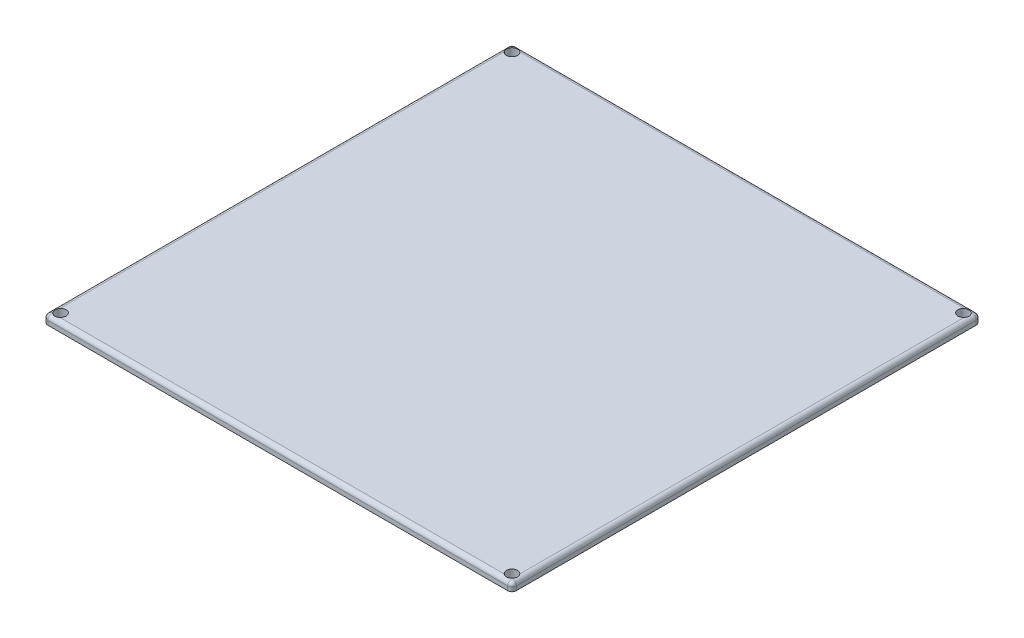
ISO-10303-21;
HEADER;
FILE_DESCRIPTION(('STEP AP214'),'2;1');
FILE_NAME('part.step','',(''),(''),'','','');
FILE_SCHEMA(('AUTOMOTIVE_DESIGN { 1 0 10303 214 1 1 1 1 }'));
ENDSEC;
DATA;
#1=APPLICATION_CONTEXT('core data for automotive mechanical design processes');
#2=APPLICATION_PROTOCOL_DEFINITION('international standard','automotive_design',2000,#1);
#3=PRODUCT_CONTEXT('',#1,'mechanical');
#4=PRODUCT('Part','Part','',(#3));
#5=PRODUCT_RELATED_PRODUCT_CATEGORY('part','',(#4));
#6=PRODUCT_DEFINITION_FORMATION('','',#4);
#7=PRODUCT_DEFINITION_CONTEXT('part definition',#1,'design');
#8=PRODUCT_DEFINITION('design','',#6,#7);
#9=PRODUCT_DEFINITION_SHAPE('','',#8);
#10=(LENGTH_UNIT() NAMED_UNIT(*) SI_UNIT(.MILLI.,.METRE.));
#11=(NAMED_UNIT(*) PLANE_ANGLE_UNIT() SI_UNIT($,.RADIAN.));
#12=(NAMED_UNIT(*) SI_UNIT($,.STERADIAN.) SOLID_ANGLE_UNIT());
#13=UNCERTAINTY_MEASURE_WITH_UNIT(LENGTH_MEASURE(1.E-05),#10,'distance_accuracy_value','');
#14=(GEOMETRIC_REPRESENTATION_CONTEXT(3) GLOBAL_UNCERTAINTY_ASSIGNED_CONTEXT((#13)) GLOBAL_UNIT_ASSIGNED_CONTEXT((#10,
#11,#12)) REPRESENTATION_CONTEXT('',''));
#15=CARTESIAN_POINT('',(0.,0.,0.));
#16=DIRECTION('',(0.,0.,1.));
#17=DIRECTION('',(1.,0.,0.));
#18=AXIS2_PLACEMENT_3D('',#15,#16,#17);
#19=CARTESIAN_POINT('',(0.,2.,0.));
#20=DIRECTION('',(0.,1.,0.));
#21=DIRECTION('',(0.,0.,1.));
#22=AXIS2_PLACEMENT_3D('',#19,#20,#21);
#23=PLANE('',#22);
#24=CARTESIAN_POINT('',(-56.4375,2.,72.765625));
#25=DIRECTION('',(0.,1.,0.));
#26=DIRECTION('',(0.,0.,1.));
#27=AXIS2_PLACEMENT_3D('',#24,#25,#26);
#28=CIRCLE('',#27,1.3);
#29=CARTESIAN_POINT('',(-55.6068376137082,2.,73.765625));
#30=VERTEX_POINT('',#29);
#31=CARTESIAN_POINT('',(-57.4375,2.,71.9349626137082));
#32=VERTEX_POINT('',#31);
#33=EDGE_CURVE('E395',#30,#32,#28,.T.);
#34=ORIENTED_EDGE('',*,*,#33,.F.);
#35=DIRECTION('',(1.,0.,0.));
#36=VECTOR('',#35,1.);
#37=CARTESIAN_POINT('',(50.5625,2.,73.765625));
#38=LINE('',#37,#36);
#39=CARTESIAN_POINT('',(48.7318376137082,2.,73.765625));
#40=VERTEX_POINT('',#39);
#41=EDGE_CURVE('E244',#30,#40,#38,.T.);
#42=ORIENTED_EDGE('',*,*,#41,.T.);
#43=CARTESIAN_POINT('',(49.5625,2.,72.765625));
#44=DIRECTION('',(0.,1.,0.));
#45=DIRECTION('',(0.,0.,1.));
#46=AXIS2_PLACEMENT_3D('',#43,#44,#45);
#47=CIRCLE('',#46,1.3);
#48=CARTESIAN_POINT('',(50.5625,2.,71.9349626137082));
#49=VERTEX_POINT('',#48);
#50=EDGE_CURVE('E387',#49,#40,#47,.T.);
#51=ORIENTED_EDGE('',*,*,#50,.F.);
#52=DIRECTION('',(0.,0.,-1.));
#53=VECTOR('',#52,1.);
#54=CARTESIAN_POINT('',(50.5625,2.,-34.234375));
#55=LINE('',#54,#53);
#56=CARTESIAN_POINT('',(50.5625,2.,-32.4037126137082));
#57=VERTEX_POINT('',#56);
#58=EDGE_CURVE('E225',#49,#57,#55,.T.);
#59=ORIENTED_EDGE('',*,*,#58,.T.);
#60=CARTESIAN_POINT('',(49.5625,2.,-33.234375));
#61=DIRECTION('',(0.,1.,0.));
#62=DIRECTION('',(0.,0.,1.));
#63=AXIS2_PLACEMENT_3D('',#60,#61,#62);
#64=CIRCLE('',#63,1.3);
#65=CARTESIAN_POINT('',(48.7318376137082,2.,-34.234375));
#66=VERTEX_POINT('',#65);
#67=EDGE_CURVE('E403',#66,#57,#64,.T.);
#68=ORIENTED_EDGE('',*,*,#67,.F.);
#69=DIRECTION('',(-1.,0.,0.));
#70=VECTOR('',#69,1.);
#71=CARTESIAN_POINT('',(-57.4375,2.,-34.234375));
#72=LINE('',#71,#70);
#73=CARTESIAN_POINT('',(-55.6068376137082,2.,-34.234375));
#74=VERTEX_POINT('',#73);
#75=EDGE_CURVE('E235',#66,#74,#72,.T.);
#76=ORIENTED_EDGE('',*,*,#75,.T.);
#77=CARTESIAN_POINT('',(-56.4375,2.,-33.234375));
#78=DIRECTION('',(0.,1.,0.));
#79=DIRECTION('',(0.,0.,1.));
#80=AXIS2_PLACEMENT_3D('',#77,#78,#79);
#81=CIRCLE('',#80,1.3);
#82=CARTESIAN_POINT('',(-57.4375,2.,-32.4037126137082));
#83=VERTEX_POINT('',#82);
#84=EDGE_CURVE('E409',#83,#74,#81,.T.);
#85=ORIENTED_EDGE('',*,*,#84,.F.);
#86=DIRECTION('',(0.,0.,1.));
#87=VECTOR('',#86,1.);
#88=CARTESIAN_POINT('',(-57.4375,2.,73.765625));
#89=LINE('',#88,#87);
#90=EDGE_CURVE('E242',#83,#32,#89,.T.);
#91=ORIENTED_EDGE('',*,*,#90,.T.);
#92=EDGE_LOOP('',(#34,#42,#51,#59,#68,#76,#85,#91));
#93=FACE_BOUND('',#92,.T.);
#94=ADVANCED_FACE('F35',(#93),#23,.T.);
#95=DIRECTION('',(0.,0.,1.));
#96=VECTOR('',#95,1.);
#97=CARTESIAN_POINT('',(-57.4375,2.,73.765625));
#98=LINE('',#97,#96);
#99=CARTESIAN_POINT('',(-57.4375,2.,73.5962873862918));
#100=VERTEX_POINT('',#99);
#101=CARTESIAN_POINT('',(-57.4375,2.,73.765625));
#102=VERTEX_POINT('',#101);
#103=EDGE_CURVE('E237',#100,#102,#98,.T.);
#104=ORIENTED_EDGE('',*,*,#103,.T.);
#105=DIRECTION('',(1.,0.,0.));
#106=VECTOR('',#105,1.);
#107=CARTESIAN_POINT('',(50.5625,2.,73.765625));
#108=LINE('',#107,#106);
#109=CARTESIAN_POINT('',(-57.2681623862918,2.,73.765625));
#110=VERTEX_POINT('',#109);
#111=EDGE_CURVE('E239',#102,#110,#108,.T.);
#112=ORIENTED_EDGE('',*,*,#111,.T.);
#113=EDGE_CURVE('E399',#100,#110,#28,.T.);
#114=ORIENTED_EDGE('',*,*,#113,.F.);
#115=EDGE_LOOP('',(#104,#112,#114));
#116=FACE_BOUND('',#115,.T.);
#117=ADVANCED_FACE('F464',(#116),#23,.T.);
#118=DIRECTION('',(-1.,0.,0.));
#119=VECTOR('',#118,1.);
#120=CARTESIAN_POINT('',(-57.4375,2.,-34.234375));
#121=LINE('',#120,#119);
#122=CARTESIAN_POINT('',(-57.2681623862918,2.,-34.234375));
#123=VERTEX_POINT('',#122);
#124=CARTESIAN_POINT('',(-57.4375,2.,-34.234375));
#125=VERTEX_POINT('',#124);
#126=EDGE_CURVE('E231',#123,#125,#121,.T.);
#127=ORIENTED_EDGE('',*,*,#126,.T.);
#128=DIRECTION('',(0.,0.,1.));
#129=VECTOR('',#128,1.);
#130=CARTESIAN_POINT('',(-57.4375,2.,73.765625));
#131=LINE('',#130,#129);
#132=CARTESIAN_POINT('',(-57.4375,2.,-34.0650373862918));
#133=VERTEX_POINT('',#132);
#134=EDGE_CURVE('E233',#125,#133,#131,.T.);
#135=ORIENTED_EDGE('',*,*,#134,.T.);
#136=EDGE_CURVE('E194',#123,#133,#81,.T.);
#137=ORIENTED_EDGE('',*,*,#136,.F.);
#138=EDGE_LOOP('',(#127,#135,#137));
#139=FACE_BOUND('',#138,.T.);
#140=ADVANCED_FACE('F468',(#139),#23,.T.);
#141=CARTESIAN_POINT('',(50.3931623862918,2.,73.765625));
#142=VERTEX_POINT('',#141);
#143=CARTESIAN_POINT('',(50.5625,2.,73.5962873862918));
#144=VERTEX_POINT('',#143);
#145=EDGE_CURVE('E392',#142,#144,#47,.T.);
#146=ORIENTED_EDGE('',*,*,#145,.F.);
#147=DIRECTION('',(1.,0.,0.));
#148=VECTOR('',#147,1.);
#149=CARTESIAN_POINT('',(50.5625,2.,73.765625));
#150=LINE('',#149,#148);
#151=CARTESIAN_POINT('',(50.5625,2.,73.765625));
#152=VERTEX_POINT('',#151);
#153=EDGE_CURVE('E229',#142,#152,#150,.T.);
#154=ORIENTED_EDGE('',*,*,#153,.T.);
#155=DIRECTION('',(0.,0.,-1.));
#156=VECTOR('',#155,1.);
#157=CARTESIAN_POINT('',(50.5625,2.,-34.234375));
#158=LINE('',#157,#156);
#159=EDGE_CURVE('E227',#152,#144,#158,.T.);
#160=ORIENTED_EDGE('',*,*,#159,.T.);
#161=EDGE_LOOP('',(#146,#154,#160));
#162=FACE_BOUND('',#161,.T.);
#163=ADVANCED_FACE('F298',(#162),#23,.T.);
#164=DIRECTION('',(0.,0.,-1.));
#165=VECTOR('',#164,1.);
#166=CARTESIAN_POINT('',(50.5625,2.,-34.234375));
#167=LINE('',#166,#165);
#168=CARTESIAN_POINT('',(50.5625,2.,-34.0650373862918));
#169=VERTEX_POINT('',#168);
#170=CARTESIAN_POINT('',(50.5625,2.,-34.234375));
#171=VERTEX_POINT('',#170);
#172=EDGE_CURVE('E221',#169,#171,#167,.T.);
#173=ORIENTED_EDGE('',*,*,#172,.T.);
#174=DIRECTION('',(-1.,0.,0.));
#175=VECTOR('',#174,1.);
#176=CARTESIAN_POINT('',(-57.4375,2.,-34.234375));
#177=LINE('',#176,#175);
#178=CARTESIAN_POINT('',(50.3931623862918,2.,-34.234375));
#179=VERTEX_POINT('',#178);
#180=EDGE_CURVE('E223',#171,#179,#177,.T.);
#181=ORIENTED_EDGE('',*,*,#180,.T.);
#182=EDGE_CURVE('E406',#169,#179,#64,.T.);
#183=ORIENTED_EDGE('',*,*,#182,.F.);
#184=EDGE_LOOP('',(#173,#181,#183));
#185=FACE_BOUND('',#184,.T.);
#186=ADVANCED_FACE('F294',(#185),#23,.T.);
#187=CARTESIAN_POINT('',(0.,0.,0.));
#188=DIRECTION('',(0.,1.,0.));
#189=DIRECTION('',(0.,0.,1.));
#190=AXIS2_PLACEMENT_3D('',#187,#188,#189);
#191=PLANE('',#190);
#192=CARTESIAN_POINT('',(-56.4375,0.,72.765625));
#193=DIRECTION('',(0.,1.,0.));
#194=DIRECTION('',(0.,0.,1.));
#195=AXIS2_PLACEMENT_3D('',#192,#193,#194);
#196=CIRCLE('',#195,1.3);
#197=CARTESIAN_POINT('',(-56.4375,0.,74.065625));
#198=VERTEX_POINT('',#197);
#199=EDGE_CURVE('E400',#198,#198,#196,.T.);
#200=ORIENTED_EDGE('',*,*,#199,.T.);
#201=EDGE_LOOP('',(#200));
#202=FACE_BOUND('',#201,.T.);
#203=CARTESIAN_POINT('',(-56.4375,0.,-33.234375));
#204=DIRECTION('',(0.,1.,0.));
#205=DIRECTION('',(0.,0.,1.));
#206=AXIS2_PLACEMENT_3D('',#203,#204,#205);
#207=CIRCLE('',#206,1.3);
#208=CARTESIAN_POINT('',(-56.4375,0.,-31.934375));
#209=VERTEX_POINT('',#208);
#210=EDGE_CURVE('E411',#209,#209,#207,.T.);
#211=ORIENTED_EDGE('',*,*,#210,.T.);
#212=EDGE_LOOP('',(#211));
#213=FACE_BOUND('',#212,.T.);
#214=DIRECTION('',(0.,0.,1.));
#215=VECTOR('',#214,1.);
#216=CARTESIAN_POINT('',(-58.4375,0.,-35.234375));
#217=LINE('',#216,#215);
#218=CARTESIAN_POINT('',(-58.4375,0.,-34.234375));
#219=VERTEX_POINT('',#218);
#220=CARTESIAN_POINT('',(-58.4375,0.,73.765625));
#221=VERTEX_POINT('',#220);
#222=EDGE_CURVE('E190',#219,#221,#217,.T.);
#223=ORIENTED_EDGE('',*,*,#222,.F.);
#224=CARTESIAN_POINT('',(-57.4375,0.,-34.234375));
#225=DIRECTION('',(0.,1.,0.));
#226=DIRECTION('',(0.,0.,1.));
#227=AXIS2_PLACEMENT_3D('',#224,#225,#226);
#228=CIRCLE('',#227,1.);
#229=CARTESIAN_POINT('',(-57.4375,0.,-35.234375));
#230=VERTEX_POINT('',#229);
#231=EDGE_CURVE('E206',#219,#230,#228,.F.);
#232=ORIENTED_EDGE('',*,*,#231,.T.);
#233=DIRECTION('',(-1.,0.,0.));
#234=VECTOR('',#233,1.);
#235=CARTESIAN_POINT('',(-58.4375,0.,-35.234375));
#236=LINE('',#235,#234);
#237=CARTESIAN_POINT('',(50.5625,0.,-35.234375));
#238=VERTEX_POINT('',#237);
#239=EDGE_CURVE('E174',#238,#230,#236,.T.);
#240=ORIENTED_EDGE('',*,*,#239,.F.);
#241=CARTESIAN_POINT('',(50.5625,0.,-34.234375));
#242=DIRECTION('',(0.,1.,0.));
#243=DIRECTION('',(0.,0.,1.));
#244=AXIS2_PLACEMENT_3D('',#241,#242,#243);
#245=CIRCLE('',#244,1.);
#246=CARTESIAN_POINT('',(51.5625,0.,-34.234375));
#247=VERTEX_POINT('',#246);
#248=EDGE_CURVE('E204',#238,#247,#245,.F.);
#249=ORIENTED_EDGE('',*,*,#248,.T.);
#250=DIRECTION('',(0.,0.,-1.));
#251=VECTOR('',#250,1.);
#252=CARTESIAN_POINT('',(51.5625,0.,-35.234375));
#253=LINE('',#252,#251);
#254=CARTESIAN_POINT('',(51.5625,0.,73.765625));
#255=VERTEX_POINT('',#254);
#256=EDGE_CURVE('E189',#255,#247,#253,.T.);
#257=ORIENTED_EDGE('',*,*,#256,.F.);
#258=CARTESIAN_POINT('',(50.5625,0.,73.765625));
#259=DIRECTION('',(0.,1.,0.));
#260=DIRECTION('',(0.,0.,1.));
#261=AXIS2_PLACEMENT_3D('',#258,#259,#260);
#262=CIRCLE('',#261,1.);
#263=CARTESIAN_POINT('',(50.5625,0.,74.765625));
#264=VERTEX_POINT('',#263);
#265=EDGE_CURVE('E188',#255,#264,#262,.F.);
#266=ORIENTED_EDGE('',*,*,#265,.T.);
#267=DIRECTION('',(1.,0.,0.));
#268=VECTOR('',#267,1.);
#269=CARTESIAN_POINT('',(-58.4375,0.,74.765625));
#270=LINE('',#269,#268);
#271=CARTESIAN_POINT('',(-57.4375,0.,74.765625));
#272=VERTEX_POINT('',#271);
#273=EDGE_CURVE('E167',#272,#264,#270,.T.);
#274=ORIENTED_EDGE('',*,*,#273,.F.);
#275=CARTESIAN_POINT('',(-57.4375,0.,73.765625));
#276=DIRECTION('',(0.,1.,0.));
#277=DIRECTION('',(0.,0.,1.));
#278=AXIS2_PLACEMENT_3D('',#275,#276,#277);
#279=CIRCLE('',#278,1.);
#280=EDGE_CURVE('E173',#272,#221,#279,.F.);
#281=ORIENTED_EDGE('',*,*,#280,.T.);
#282=EDGE_LOOP('',(#223,#232,#240,#249,#257,#266,#274,#281));
#283=FACE_BOUND('',#282,.T.);
#284=CARTESIAN_POINT('',(49.5625,0.,-33.234375));
#285=DIRECTION('',(0.,1.,0.));
#286=DIRECTION('',(0.,0.,1.));
#287=AXIS2_PLACEMENT_3D('',#284,#285,#286);
#288=CIRCLE('',#287,1.3);
#289=CARTESIAN_POINT('',(49.5625,0.,-31.934375));
#290=VERTEX_POINT('',#289);
#291=EDGE_CURVE('E398',#290,#290,#288,.T.);
#292=ORIENTED_EDGE('',*,*,#291,.T.);
#293=EDGE_LOOP('',(#292));
#294=FACE_BOUND('',#293,.T.);
#295=CARTESIAN_POINT('',(49.5625,0.,72.765625));
#296=DIRECTION('',(0.,1.,0.));
#297=DIRECTION('',(0.,0.,1.));
#298=AXIS2_PLACEMENT_3D('',#295,#296,#297);
#299=CIRCLE('',#298,1.3);
#300=CARTESIAN_POINT('',(49.5625,0.,74.065625));
#301=VERTEX_POINT('',#300);
#302=EDGE_CURVE('E383',#301,#301,#299,.T.);
#303=ORIENTED_EDGE('',*,*,#302,.T.);
#304=EDGE_LOOP('',(#303));
#305=FACE_BOUND('',#304,.T.);
#306=ADVANCED_FACE('F184',(#202,#213,#283,#294,#305),#191,.F.);
#307=CARTESIAN_POINT('',(-58.4375,2.,-35.234375));
#308=DIRECTION('',(1.,0.,0.));
#309=DIRECTION('',(0.,0.,-1.));
#310=AXIS2_PLACEMENT_3D('',#307,#308,#309);
#311=PLANE('',#310);
#312=DIRECTION('',(0.,-1.,0.));
#313=VECTOR('',#312,1.);
#314=CARTESIAN_POINT('',(-58.4375,2.,73.765625));
#315=LINE('',#314,#313);
#316=CARTESIAN_POINT('',(-58.4375,1.,73.765625));
#317=VERTEX_POINT('',#316);
#318=EDGE_CURVE('E180',#221,#317,#315,.F.);
#319=ORIENTED_EDGE('',*,*,#318,.T.);
#320=DIRECTION('',(0.,0.,1.));
#321=VECTOR('',#320,1.);
#322=CARTESIAN_POINT('',(-58.4375,1.,-34.234375));
#323=LINE('',#322,#321);
#324=CARTESIAN_POINT('',(-58.4375,1.,-34.234375));
#325=VERTEX_POINT('',#324);
#326=EDGE_CURVE('E279',#317,#325,#323,.F.);
#327=ORIENTED_EDGE('',*,*,#326,.T.);
#328=DIRECTION('',(0.,-1.,0.));
#329=VECTOR('',#328,1.);
#330=CARTESIAN_POINT('',(-58.4375,2.,-34.234375));
#331=LINE('',#330,#329);
#332=EDGE_CURVE('E201',#325,#219,#331,.T.);
#333=ORIENTED_EDGE('',*,*,#332,.T.);
#334=ORIENTED_EDGE('',*,*,#222,.T.);
#335=EDGE_LOOP('',(#319,#327,#333,#334));
#336=FACE_BOUND('',#335,.T.);
#337=ADVANCED_FACE('F302',(#336),#311,.F.);
#338=CARTESIAN_POINT('',(-58.4375,2.,74.765625));
#339=DIRECTION('',(0.,0.,-1.));
#340=DIRECTION('',(-1.,0.,0.));
#341=AXIS2_PLACEMENT_3D('',#338,#339,#340);
#342=PLANE('',#341);
#343=DIRECTION('',(0.,-1.,0.));
#344=VECTOR('',#343,1.);
#345=CARTESIAN_POINT('',(50.5625,2.,74.765625));
#346=LINE('',#345,#344);
#347=CARTESIAN_POINT('',(50.5625,1.,74.765625));
#348=VERTEX_POINT('',#347);
#349=EDGE_CURVE('E216',#264,#348,#346,.F.);
#350=ORIENTED_EDGE('',*,*,#349,.T.);
#351=DIRECTION('',(1.,0.,0.));
#352=VECTOR('',#351,1.);
#353=CARTESIAN_POINT('',(-57.4375,1.,74.765625));
#354=LINE('',#353,#352);
#355=CARTESIAN_POINT('',(-57.4375,1.,74.765625));
#356=VERTEX_POINT('',#355);
#357=EDGE_CURVE('E170',#348,#356,#354,.F.);
#358=ORIENTED_EDGE('',*,*,#357,.T.);
#359=DIRECTION('',(0.,-1.,0.));
#360=VECTOR('',#359,1.);
#361=CARTESIAN_POINT('',(-57.4375,2.,74.765625));
#362=LINE('',#361,#360);
#363=EDGE_CURVE('E162',#356,#272,#362,.T.);
#364=ORIENTED_EDGE('',*,*,#363,.T.);
#365=ORIENTED_EDGE('',*,*,#273,.T.);
#366=EDGE_LOOP('',(#350,#358,#364,#365));
#367=FACE_BOUND('',#366,.T.);
#368=ADVANCED_FACE('F165',(#367),#342,.F.);
#369=CARTESIAN_POINT('',(51.5625,2.,-35.234375));
#370=DIRECTION('',(-1.,0.,0.));
#371=DIRECTION('',(0.,0.,1.));
#372=AXIS2_PLACEMENT_3D('',#369,#370,#371);
#373=PLANE('',#372);
#374=DIRECTION('',(0.,-1.,0.));
#375=VECTOR('',#374,1.);
#376=CARTESIAN_POINT('',(51.5625,2.,-34.234375));
#377=LINE('',#376,#375);
#378=CARTESIAN_POINT('',(51.5625,1.,-34.234375));
#379=VERTEX_POINT('',#378);
#380=EDGE_CURVE('E214',#247,#379,#377,.F.);
#381=ORIENTED_EDGE('',*,*,#380,.T.);
#382=DIRECTION('',(0.,0.,-1.));
#383=VECTOR('',#382,1.);
#384=CARTESIAN_POINT('',(51.5625,1.,73.765625));
#385=LINE('',#384,#383);
#386=CARTESIAN_POINT('',(51.5625,1.,73.765625));
#387=VERTEX_POINT('',#386);
#388=EDGE_CURVE('E11',#379,#387,#385,.F.);
#389=ORIENTED_EDGE('',*,*,#388,.T.);
#390=DIRECTION('',(0.,-1.,0.));
#391=VECTOR('',#390,1.);
#392=CARTESIAN_POINT('',(51.5625,2.,73.765625));
#393=LINE('',#392,#391);
#394=EDGE_CURVE('E212',#387,#255,#393,.T.);
#395=ORIENTED_EDGE('',*,*,#394,.T.);
#396=ORIENTED_EDGE('',*,*,#256,.T.);
#397=EDGE_LOOP('',(#381,#389,#395,#396));
#398=FACE_BOUND('',#397,.T.);
#399=ADVANCED_FACE('F306',(#398),#373,.F.);
#400=CARTESIAN_POINT('',(-58.4375,2.,-35.234375));
#401=DIRECTION('',(0.,0.,1.));
#402=DIRECTION('',(1.,0.,0.));
#403=AXIS2_PLACEMENT_3D('',#400,#401,#402);
#404=PLANE('',#403);
#405=DIRECTION('',(0.,-1.,0.));
#406=VECTOR('',#405,1.);
#407=CARTESIAN_POINT('',(-57.4375,2.,-35.234375));
#408=LINE('',#407,#406);
#409=CARTESIAN_POINT('',(-57.4375,1.,-35.234375));
#410=VERTEX_POINT('',#409);
#411=EDGE_CURVE('E210',#230,#410,#408,.F.);
#412=ORIENTED_EDGE('',*,*,#411,.T.);
#413=DIRECTION('',(-1.,0.,0.));
#414=VECTOR('',#413,1.);
#415=CARTESIAN_POINT('',(50.5625,1.,-35.234375));
#416=LINE('',#415,#414);
#417=CARTESIAN_POINT('',(50.5625,1.,-35.234375));
#418=VERTEX_POINT('',#417);
#419=EDGE_CURVE('E59',#410,#418,#416,.F.);
#420=ORIENTED_EDGE('',*,*,#419,.T.);
#421=DIRECTION('',(0.,-1.,0.));
#422=VECTOR('',#421,1.);
#423=CARTESIAN_POINT('',(50.5625,2.,-35.234375));
#424=LINE('',#423,#422);
#425=EDGE_CURVE('E208',#418,#238,#424,.T.);
#426=ORIENTED_EDGE('',*,*,#425,.T.);
#427=ORIENTED_EDGE('',*,*,#239,.T.);
#428=EDGE_LOOP('',(#412,#420,#426,#427));
#429=FACE_BOUND('',#428,.T.);
#430=ADVANCED_FACE('F291',(#429),#404,.F.);
#431=CARTESIAN_POINT('',(-56.4375,2.,-33.234375));
#432=DIRECTION('',(0.,-1.,0.));
#433=DIRECTION('',(0.,0.,-1.));
#434=AXIS2_PLACEMENT_3D('',#431,#432,#433);
#435=CYLINDRICAL_SURFACE('',#434,1.3);
#436=ORIENTED_EDGE('',*,*,#136,.T.);
#437=CARTESIAN_POINT('',(-57.4375,2.,-34.0650373862918));
#438=CARTESIAN_POINT('',(-57.4604251223826,1.9999961760534,-34.0374403102604));
#439=CARTESIAN_POINT('',(-57.4821849188267,1.99921243552188,-34.0089179762548));
#440=CARTESIAN_POINT('',(-57.5232425434941,1.99653020231395,-33.9502275512251));
#441=CARTESIAN_POINT('',(-57.542541966135,1.99463243608514,-33.9200605442977));
#442=CARTESIAN_POINT('',(-57.5965939883878,1.9879330826761,-33.8273460760095));
#443=CARTESIAN_POINT('',(-57.6275023668593,1.98212536278494,-33.7625827221245));
#444=CARTESIAN_POINT('',(-57.6782433442636,1.97093841622193,-33.628921460695));
#445=CARTESIAN_POINT('',(-57.6980859557925,1.96555880597682,-33.5600273534935));
#446=CARTESIAN_POINT('',(-57.7261836812957,1.95753839714111,-33.4198237602665));
#447=CARTESIAN_POINT('',(-57.734454770284,1.95489382402592,-33.3485177436489));
#448=CARTESIAN_POINT('',(-57.7391534199322,1.95342172722993,-33.2052940537781));
#449=CARTESIAN_POINT('',(-57.7355511623464,1.95460381353484,-33.1333752936725));
#450=CARTESIAN_POINT('',(-57.7165617946311,1.96032193448002,-32.9911526513206));
#451=CARTESIAN_POINT('',(-57.7011564979927,1.96486314459481,-32.9208514337837));
#452=CARTESIAN_POINT('',(-57.6593134097053,1.97532219691394,-32.7847210660617));
#453=CARTESIAN_POINT('',(-57.6330151627559,1.9812222219503,-32.7188471826613));
#454=CARTESIAN_POINT('',(-57.5700571853419,1.99168643128433,-32.5922848877725));
#455=CARTESIAN_POINT('',(-57.5334266812636,1.99625431067836,-32.5315824697225));
#456=CARTESIAN_POINT('',(-57.4747222154707,1.99945610697892,-32.4501148778391));
#457=CARTESIAN_POINT('',(-57.4565072835425,1.99999461434717,-32.4265838478557));
#458=CARTESIAN_POINT('',(-57.4375,2.,-32.4037126137082));
#459=B_SPLINE_CURVE_WITH_KNOTS('',3,(#437,#438,#439,#440,#441,#442,#443,#444,#445,#446,#447,
#448,#449,#450,#451,#452,#453,#454,#455,#456,#457,#458),.UNSPECIFIED.,.F.,.F.,(4,2,2,2,2,2,2,2,
2,2,4),(0.,0.107536376086472,0.215002706304654,0.429925966078585,0.644654440811261,
0.859086179590809,1.07405684352639,1.28935940909704,1.5019851867795,1.71401544932163,
1.80322525583391),.UNSPECIFIED.);
#460=EDGE_CURVE('E272',#133,#83,#459,.T.);
#461=ORIENTED_EDGE('',*,*,#460,.T.);
#462=ORIENTED_EDGE('',*,*,#84,.T.);
#463=CARTESIAN_POINT('',(-55.6068376137082,2.,-34.234375));
#464=CARTESIAN_POINT('',(-55.6344346897396,1.9999961760534,-34.2573001223826));
#465=CARTESIAN_POINT('',(-55.6629570237451,1.99921243552188,-34.2790599188267));
#466=CARTESIAN_POINT('',(-55.7216474487749,1.99653020231395,-34.3201175434941));
#467=CARTESIAN_POINT('',(-55.7518144557023,1.99463243608514,-34.339416966135));
#468=CARTESIAN_POINT('',(-55.8445289239905,1.98793308267609,-34.3934689883878));
#469=CARTESIAN_POINT('',(-55.9092922778755,1.98212536278494,-34.4243773668593));
#470=CARTESIAN_POINT('',(-56.042953539305,1.97093841622193,-34.4751183442636));
#471=CARTESIAN_POINT('',(-56.1118476465065,1.96555880597682,-34.4949609557925));
#472=CARTESIAN_POINT('',(-56.2520512397335,1.95753839714112,-34.5230586812957));
#473=CARTESIAN_POINT('',(-56.3233572563511,1.95489382402592,-34.531329770284));
#474=CARTESIAN_POINT('',(-56.4665809462219,1.95342172722994,-34.5360284199322));
#475=CARTESIAN_POINT('',(-56.5384997063275,1.95460381353484,-34.5324261623464));
#476=CARTESIAN_POINT('',(-56.6807223486794,1.96032193448002,-34.5134367946311));
#477=CARTESIAN_POINT('',(-56.7510235662163,1.96486314459482,-34.4980314979927));
#478=CARTESIAN_POINT('',(-56.8871539339383,1.97532219691394,-34.4561884097052));
#479=CARTESIAN_POINT('',(-56.9530278173387,1.9812222219503,-34.4298901627559));
#480=CARTESIAN_POINT('',(-57.0795901122275,1.99168643128433,-34.3669321853419));
#481=CARTESIAN_POINT('',(-57.1402925302775,1.99625431067836,-34.3303016812636));
#482=CARTESIAN_POINT('',(-57.2217601221608,1.99945610697892,-34.2715972154707));
#483=CARTESIAN_POINT('',(-57.2452911521443,1.99999461434717,-34.2533822835425));
#484=CARTESIAN_POINT('',(-57.2681623862918,2.,-34.234375));
#485=B_SPLINE_CURVE_WITH_KNOTS('',3,(#463,#464,#465,#466,#467,#468,#469,#470,#471,#472,#473,
#474,#475,#476,#477,#478,#479,#480,#481,#482,#483,#484),.UNSPECIFIED.,.F.,.F.,(4,2,2,2,2,2,2,2,
2,2,4),(0.,0.107536376086467,0.215002706304655,0.429925966078586,0.644654440811246,
0.859086179590808,1.07405684352638,1.28935940909704,1.50198518677949,1.71401544932162,
1.80322525583388),.UNSPECIFIED.);
#486=EDGE_CURVE('E280',#74,#123,#485,.T.);
#487=ORIENTED_EDGE('',*,*,#486,.T.);
#488=EDGE_LOOP('',(#436,#461,#462,#487));
#489=FACE_BOUND('',#488,.T.);
#490=ORIENTED_EDGE('',*,*,#210,.F.);
#491=EDGE_LOOP('',(#490));
#492=FACE_BOUND('',#491,.T.);
#493=ADVANCED_FACE('F286',(#489,#492),#435,.F.);
#494=CARTESIAN_POINT('',(49.5625,2.,-33.234375));
#495=DIRECTION('',(0.,-1.,0.));
#496=DIRECTION('',(0.,0.,-1.));
#497=AXIS2_PLACEMENT_3D('',#494,#495,#496);
#498=CYLINDRICAL_SURFACE('',#497,1.3);
#499=ORIENTED_EDGE('',*,*,#182,.T.);
#500=CARTESIAN_POINT('',(50.3931623862918,2.,-34.234375));
#501=CARTESIAN_POINT('',(50.3655653102604,1.9999961760534,-34.2573001223826));
#502=CARTESIAN_POINT('',(50.3370429762548,1.99921243552188,-34.2790599188267));
#503=CARTESIAN_POINT('',(50.2783525512251,1.99653020231395,-34.3201175434941));
#504=CARTESIAN_POINT('',(50.2481855442977,1.99463243608514,-34.339416966135));
#505=CARTESIAN_POINT('',(50.1554710760095,1.98793308267609,-34.3934689883878));
#506=CARTESIAN_POINT('',(50.0907077221245,1.98212536278494,-34.4243773668593));
#507=CARTESIAN_POINT('',(49.957046460695,1.97093841622193,-34.4751183442636));
#508=CARTESIAN_POINT('',(49.8881523534935,1.96555880597682,-34.4949609557925));
#509=CARTESIAN_POINT('',(49.7479487602665,1.95753839714112,-34.5230586812957));
#510=CARTESIAN_POINT('',(49.6766427436489,1.95489382402592,-34.531329770284));
#511=CARTESIAN_POINT('',(49.5334190537781,1.95342172722994,-34.5360284199322));
#512=CARTESIAN_POINT('',(49.4615002936725,1.95460381353484,-34.5324261623464));
#513=CARTESIAN_POINT('',(49.3192776513206,1.96032193448002,-34.5134367946311));
#514=CARTESIAN_POINT('',(49.2489764337837,1.96486314459482,-34.4980314979927));
#515=CARTESIAN_POINT('',(49.1128460660617,1.97532219691394,-34.4561884097052));
#516=CARTESIAN_POINT('',(49.0469721826613,1.9812222219503,-34.4298901627559));
#517=CARTESIAN_POINT('',(48.9204098877725,1.99168643128433,-34.3669321853419));
#518=CARTESIAN_POINT('',(48.8597074697225,1.99625431067836,-34.3303016812636));
#519=CARTESIAN_POINT('',(48.7782398778392,1.99945610697892,-34.2715972154707));
#520=CARTESIAN_POINT('',(48.7547088478557,1.99999461434717,-34.2533822835425));
#521=CARTESIAN_POINT('',(48.7318376137082,2.,-34.234375));
#522=B_SPLINE_CURVE_WITH_KNOTS('',3,(#500,#501,#502,#503,#504,#505,#506,#507,#508,#509,#510,
#511,#512,#513,#514,#515,#516,#517,#518,#519,#520,#521),.UNSPECIFIED.,.F.,.F.,(4,2,2,2,2,2,2,2,
2,2,4),(0.,0.107536376086467,0.215002706304655,0.429925966078586,0.644654440811246,
0.859086179590808,1.07405684352638,1.28935940909704,1.50198518677949,1.71401544932162,
1.80322525583388),.UNSPECIFIED.);
#523=EDGE_CURVE('E352',#179,#66,#522,.T.);
#524=ORIENTED_EDGE('',*,*,#523,.T.);
#525=ORIENTED_EDGE('',*,*,#67,.T.);
#526=CARTESIAN_POINT('',(50.5625,2.,-32.4037126137082));
#527=CARTESIAN_POINT('',(50.5854251223826,1.9999961760534,-32.4313096897396));
#528=CARTESIAN_POINT('',(50.6071849188267,1.99921243552188,-32.4598320237451));
#529=CARTESIAN_POINT('',(50.6482425434942,1.99653020231395,-32.5185224487748));
#530=CARTESIAN_POINT('',(50.667541966135,1.99463243608514,-32.5486894557023));
#531=CARTESIAN_POINT('',(50.7215939883879,1.98793308267609,-32.6414039239905));
#532=CARTESIAN_POINT('',(50.7525023668593,1.98212536278494,-32.7061672778755));
#533=CARTESIAN_POINT('',(50.8032433442636,1.97093841622193,-32.839828539305));
#534=CARTESIAN_POINT('',(50.8230859557925,1.96555880597682,-32.9087226465065));
#535=CARTESIAN_POINT('',(50.8511836812957,1.95753839714111,-33.0489262397335));
#536=CARTESIAN_POINT('',(50.859454770284,1.95489382402592,-33.1202322563511));
#537=CARTESIAN_POINT('',(50.8641534199322,1.95342172722994,-33.2634559462219));
#538=CARTESIAN_POINT('',(50.8605511623464,1.95460381353484,-33.3353747063275));
#539=CARTESIAN_POINT('',(50.8415617946311,1.96032193448002,-33.4775973486794));
#540=CARTESIAN_POINT('',(50.8261564979927,1.96486314459482,-33.5478985662163));
#541=CARTESIAN_POINT('',(50.7843134097053,1.97532219691394,-33.6840289339383));
#542=CARTESIAN_POINT('',(50.7580151627559,1.9812222219503,-33.7499028173387));
#543=CARTESIAN_POINT('',(50.6950571853419,1.99168643128433,-33.8764651122275));
#544=CARTESIAN_POINT('',(50.6584266812636,1.99625431067836,-33.9371675302775));
#545=CARTESIAN_POINT('',(50.5997222154707,1.99945610697893,-34.0186351221608));
#546=CARTESIAN_POINT('',(50.5815072835425,1.99999461434717,-34.0421661521443));
#547=CARTESIAN_POINT('',(50.5625,2.,-34.0650373862918));
#548=B_SPLINE_CURVE_WITH_KNOTS('',3,(#526,#527,#528,#529,#530,#531,#532,#533,#534,#535,#536,
#537,#538,#539,#540,#541,#542,#543,#544,#545,#546,#547),.UNSPECIFIED.,.F.,.F.,(4,2,2,2,2,2,2,2,
2,2,4),(0.,0.107536376086472,0.215002706304654,0.429925966078585,0.644654440811245,
0.859086179590808,1.07405684352638,1.28935940909704,1.50198518677949,1.71401544932162,
1.80322525583388),.UNSPECIFIED.);
#549=EDGE_CURVE('E347',#57,#169,#548,.T.);
#550=ORIENTED_EDGE('',*,*,#549,.T.);
#551=EDGE_LOOP('',(#499,#524,#525,#550));
#552=FACE_BOUND('',#551,.T.);
#553=ORIENTED_EDGE('',*,*,#291,.F.);
#554=EDGE_LOOP('',(#553));
#555=FACE_BOUND('',#554,.T.);
#556=ADVANCED_FACE('F290',(#552,#555),#498,.F.);
#557=CARTESIAN_POINT('',(-56.4375,2.,72.765625));
#558=DIRECTION('',(0.,-1.,0.));
#559=DIRECTION('',(0.,0.,-1.));
#560=AXIS2_PLACEMENT_3D('',#557,#558,#559);
#561=CYLINDRICAL_SURFACE('',#560,1.3);
#562=ORIENTED_EDGE('',*,*,#113,.T.);
#563=CARTESIAN_POINT('',(-57.2681623862918,2.,73.765625));
#564=CARTESIAN_POINT('',(-57.2405653102604,1.9999961760534,73.7885501223826));
#565=CARTESIAN_POINT('',(-57.2120429762548,1.99921243552188,73.8103099188267));
#566=CARTESIAN_POINT('',(-57.1533525512251,1.99653020231395,73.8513675434941));
#567=CARTESIAN_POINT('',(-57.1231855442977,1.99463243608514,73.870666966135));
#568=CARTESIAN_POINT('',(-57.0304710760095,1.98793308267609,73.9247189883879));
#569=CARTESIAN_POINT('',(-56.9657077221245,1.98212536278494,73.9556273668593));
#570=CARTESIAN_POINT('',(-56.8320464606949,1.97093841622193,74.0063683442636));
#571=CARTESIAN_POINT('',(-56.7631523534935,1.96555880597682,74.0262109557925));
#572=CARTESIAN_POINT('',(-56.6229487602665,1.95753839714111,74.0543086812957));
#573=CARTESIAN_POINT('',(-56.5516427436489,1.95489382402592,74.062579770284));
#574=CARTESIAN_POINT('',(-56.408419053778,1.95342172722994,74.0672784199322));
#575=CARTESIAN_POINT('',(-56.3365002936725,1.95460381353484,74.0636761623464));
#576=CARTESIAN_POINT('',(-56.1942776513206,1.96032193448003,74.0446867946311));
#577=CARTESIAN_POINT('',(-56.1239764337837,1.96486314459482,74.0292814979927));
#578=CARTESIAN_POINT('',(-55.9878460660617,1.97532219691394,73.9874384097052));
#579=CARTESIAN_POINT('',(-55.9219721826613,1.9812222219503,73.9611401627559));
#580=CARTESIAN_POINT('',(-55.7954098877725,1.99168643128433,73.8981821853419));
#581=CARTESIAN_POINT('',(-55.7347074697225,1.99625431067836,73.8615516812636));
#582=CARTESIAN_POINT('',(-55.6532398778391,1.99945610697893,73.8028472154707));
#583=CARTESIAN_POINT('',(-55.6297088478557,1.99999461434717,73.7846322835425));
#584=CARTESIAN_POINT('',(-55.6068376137082,2.,73.765625));
#585=B_SPLINE_CURVE_WITH_KNOTS('',3,(#563,#564,#565,#566,#567,#568,#569,#570,#571,#572,#573,
#574,#575,#576,#577,#578,#579,#580,#581,#582,#583,#584),.UNSPECIFIED.,.F.,.F.,(4,2,2,2,2,2,2,2,
2,2,4),(0.,0.107536376086467,0.215002706304655,0.429925966078598,0.644654440811273,
0.859086179590821,1.0740568435264,1.28935940909706,1.50198518677951,1.71401544932163,
1.80322525583388),.UNSPECIFIED.);
#586=EDGE_CURVE('E252',#110,#30,#585,.T.);
#587=ORIENTED_EDGE('',*,*,#586,.T.);
#588=ORIENTED_EDGE('',*,*,#33,.T.);
#589=CARTESIAN_POINT('',(-57.4375,2.,71.9349626137082));
#590=CARTESIAN_POINT('',(-57.4604251223825,1.9999961760534,71.9625596897396));
#591=CARTESIAN_POINT('',(-57.4821849188267,1.99921243552188,71.9910820237452));
#592=CARTESIAN_POINT('',(-57.5232425434941,1.99653020231395,72.0497724487749));
#593=CARTESIAN_POINT('',(-57.542541966135,1.99463243608514,72.0799394557023));
#594=CARTESIAN_POINT('',(-57.5965939883879,1.98793308267609,72.1726539239905));
#595=CARTESIAN_POINT('',(-57.6275023668593,1.98212536278494,72.2374172778755));
#596=CARTESIAN_POINT('',(-57.6782433442636,1.97093841622193,72.3710785393051));
#597=CARTESIAN_POINT('',(-57.6980859557925,1.96555880597682,72.4399726465065));
#598=CARTESIAN_POINT('',(-57.7261836812957,1.95753839714111,72.5801762397335));
#599=CARTESIAN_POINT('',(-57.734454770284,1.95489382402592,72.6514822563511));
#600=CARTESIAN_POINT('',(-57.7391534199321,1.95342172722994,72.794705946222));
#601=CARTESIAN_POINT('',(-57.7355511623463,1.95460381353484,72.8666247063275));
#602=CARTESIAN_POINT('',(-57.7165617946311,1.96032193448003,73.0088473486794));
#603=CARTESIAN_POINT('',(-57.7011564979927,1.96486314459482,73.0791485662163));
#604=CARTESIAN_POINT('',(-57.6593134097052,1.97532219691394,73.2152789339383));
#605=CARTESIAN_POINT('',(-57.6330151627559,1.9812222219503,73.2811528173387));
#606=CARTESIAN_POINT('',(-57.5700571853419,1.99168643128433,73.4077151122275));
#607=CARTESIAN_POINT('',(-57.5334266812636,1.99625431067836,73.4684175302775));
#608=CARTESIAN_POINT('',(-57.4747222154707,1.99945610697893,73.5498851221609));
#609=CARTESIAN_POINT('',(-57.4565072835425,1.99999461434717,73.5734161521443));
#610=CARTESIAN_POINT('',(-57.4375,2.,73.5962873862918));
#611=B_SPLINE_CURVE_WITH_KNOTS('',3,(#589,#590,#591,#592,#593,#594,#595,#596,#597,#598,#599,
#600,#601,#602,#603,#604,#605,#606,#607,#608,#609,#610),.UNSPECIFIED.,.F.,.F.,(4,2,2,2,2,2,2,2,
2,2,4),(0.,0.107536376086476,0.215002706304668,0.429925966078602,0.644654440811282,
0.859086179590837,1.07405684352641,1.28935940909706,1.5019851867795,1.71401544932164,
1.80322525583387),.UNSPECIFIED.);
#612=EDGE_CURVE('E246',#32,#100,#611,.T.);
#613=ORIENTED_EDGE('',*,*,#612,.T.);
#614=EDGE_LOOP('',(#562,#587,#588,#613));
#615=FACE_BOUND('',#614,.T.);
#616=ORIENTED_EDGE('',*,*,#199,.F.);
#617=EDGE_LOOP('',(#616));
#618=FACE_BOUND('',#617,.T.);
#619=ADVANCED_FACE('F258',(#615,#618),#561,.F.);
#620=CARTESIAN_POINT('',(49.5625,2.,72.765625));
#621=DIRECTION('',(0.,-1.,0.));
#622=DIRECTION('',(0.,0.,-1.));
#623=AXIS2_PLACEMENT_3D('',#620,#621,#622);
#624=CYLINDRICAL_SURFACE('',#623,1.3);
#625=ORIENTED_EDGE('',*,*,#50,.T.);
#626=CARTESIAN_POINT('',(48.7318376137082,2.,73.765625));
#627=CARTESIAN_POINT('',(48.7594346897396,1.9999961760534,73.7885501223826));
#628=CARTESIAN_POINT('',(48.7879570237452,1.99921243552188,73.8103099188267));
#629=CARTESIAN_POINT('',(48.8466474487749,1.99653020231395,73.8513675434941));
#630=CARTESIAN_POINT('',(48.8768144557023,1.99463243608514,73.870666966135));
#631=CARTESIAN_POINT('',(48.9695289239905,1.98793308267609,73.9247189883879));
#632=CARTESIAN_POINT('',(49.0342922778755,1.98212536278494,73.9556273668593));
#633=CARTESIAN_POINT('',(49.1679535393051,1.97093841622193,74.0063683442636));
#634=CARTESIAN_POINT('',(49.2368476465065,1.96555880597682,74.0262109557925));
#635=CARTESIAN_POINT('',(49.3770512397335,1.95753839714111,74.0543086812957));
#636=CARTESIAN_POINT('',(49.4483572563511,1.95489382402592,74.062579770284));
#637=CARTESIAN_POINT('',(49.591580946222,1.95342172722994,74.0672784199322));
#638=CARTESIAN_POINT('',(49.6634997063275,1.95460381353484,74.0636761623464));
#639=CARTESIAN_POINT('',(49.8057223486794,1.96032193448003,74.0446867946311));
#640=CARTESIAN_POINT('',(49.8760235662163,1.96486314459482,74.0292814979927));
#641=CARTESIAN_POINT('',(50.0121539339383,1.97532219691394,73.9874384097052));
#642=CARTESIAN_POINT('',(50.0780278173387,1.9812222219503,73.9611401627559));
#643=CARTESIAN_POINT('',(50.2045901122275,1.99168643128433,73.8981821853419));
#644=CARTESIAN_POINT('',(50.2652925302775,1.99625431067836,73.8615516812636));
#645=CARTESIAN_POINT('',(50.3467601221609,1.99945610697893,73.8028472154707));
#646=CARTESIAN_POINT('',(50.3702911521443,1.99999461434717,73.7846322835425));
#647=CARTESIAN_POINT('',(50.3931623862918,2.,73.765625));
#648=B_SPLINE_CURVE_WITH_KNOTS('',3,(#626,#627,#628,#629,#630,#631,#632,#633,#634,#635,#636,
#637,#638,#639,#640,#641,#642,#643,#644,#645,#646,#647),.UNSPECIFIED.,.F.,.F.,(4,2,2,2,2,2,2,2,
2,2,4),(0.,0.107536376086467,0.215002706304655,0.429925966078598,0.644654440811273,
0.859086179590821,1.0740568435264,1.28935940909706,1.50198518677951,1.71401544932163,
1.80322525583388),.UNSPECIFIED.);
#649=EDGE_CURVE('E444',#40,#142,#648,.T.);
#650=ORIENTED_EDGE('',*,*,#649,.T.);
#651=ORIENTED_EDGE('',*,*,#145,.T.);
#652=CARTESIAN_POINT('',(50.5625,2.,73.5962873862918));
#653=CARTESIAN_POINT('',(50.5854251223826,1.9999961760534,73.5686903102604));
#654=CARTESIAN_POINT('',(50.6071849188267,1.99921243552188,73.5401679762549));
#655=CARTESIAN_POINT('',(50.6482425434942,1.99653020231395,73.4814775512252));
#656=CARTESIAN_POINT('',(50.667541966135,1.99463243608514,73.4513105442977));
#657=CARTESIAN_POINT('',(50.7215939883879,1.98793308267609,73.3585960760095));
#658=CARTESIAN_POINT('',(50.7525023668593,1.98212536278494,73.2938327221245));
#659=CARTESIAN_POINT('',(50.8032433442636,1.97093841622193,73.160171460695));
#660=CARTESIAN_POINT('',(50.8230859557925,1.96555880597682,73.0912773534935));
#661=CARTESIAN_POINT('',(50.8511836812957,1.95753839714111,72.9510737602665));
#662=CARTESIAN_POINT('',(50.859454770284,1.95489382402592,72.8797677436489));
#663=CARTESIAN_POINT('',(50.8641534199322,1.95342172722993,72.7365440537781));
#664=CARTESIAN_POINT('',(50.8605511623464,1.95460381353484,72.6646252936725));
#665=CARTESIAN_POINT('',(50.8415617946311,1.96032193448002,72.5224026513206));
#666=CARTESIAN_POINT('',(50.8261564979927,1.96486314459481,72.4521014337837));
#667=CARTESIAN_POINT('',(50.7843134097053,1.97532219691393,72.3159710660617));
#668=CARTESIAN_POINT('',(50.7580151627559,1.9812222219503,72.2500971826613));
#669=CARTESIAN_POINT('',(50.6950571853419,1.99168643128433,72.1235348877725));
#670=CARTESIAN_POINT('',(50.6584266812637,1.99625431067836,72.0628324697225));
#671=CARTESIAN_POINT('',(50.5997222154707,1.99945610697892,71.9813648778392));
#672=CARTESIAN_POINT('',(50.5815072835425,1.99999461434717,71.9578338478557));
#673=CARTESIAN_POINT('',(50.5625,2.,71.9349626137082));
#674=B_SPLINE_CURVE_WITH_KNOTS('',3,(#652,#653,#654,#655,#656,#657,#658,#659,#660,#661,#662,
#663,#664,#665,#666,#667,#668,#669,#670,#671,#672,#673),.UNSPECIFIED.,.F.,.F.,(4,2,2,2,2,2,2,2,
2,2,4),(0.,0.107536376086457,0.215002706304648,0.429925966078586,0.644654440811268,
0.85908617959081,1.07405684352638,1.28935940909703,1.5019851867795,1.71401544932162,
1.80322525583389),.UNSPECIFIED.);
#675=EDGE_CURVE('E341',#144,#49,#674,.T.);
#676=ORIENTED_EDGE('',*,*,#675,.T.);
#677=EDGE_LOOP('',(#625,#650,#651,#676));
#678=FACE_BOUND('',#677,.T.);
#679=ORIENTED_EDGE('',*,*,#302,.F.);
#680=EDGE_LOOP('',(#679));
#681=FACE_BOUND('',#680,.T.);
#682=ADVANCED_FACE('F318',(#678,#681),#624,.F.);
#683=CARTESIAN_POINT('',(-57.4375,2.,73.765625));
#684=DIRECTION('',(0.,-1.,0.));
#685=DIRECTION('',(0.,0.,-1.));
#686=AXIS2_PLACEMENT_3D('',#683,#684,#685);
#687=CYLINDRICAL_SURFACE('',#686,1.);
#688=ORIENTED_EDGE('',*,*,#363,.F.);
#689=CARTESIAN_POINT('',(-57.4375,1.,73.765625));
#690=DIRECTION('',(0.,-1.,0.));
#691=DIRECTION('',(0.,0.,-1.));
#692=AXIS2_PLACEMENT_3D('',#689,#690,#691);
#693=CIRCLE('',#692,1.);
#694=EDGE_CURVE('E451',#356,#317,#693,.T.);
#695=ORIENTED_EDGE('',*,*,#694,.T.);
#696=ORIENTED_EDGE('',*,*,#318,.F.);
#697=ORIENTED_EDGE('',*,*,#280,.F.);
#698=EDGE_LOOP('',(#688,#695,#696,#697));
#699=FACE_BOUND('',#698,.T.);
#700=ADVANCED_FACE('F178',(#699),#687,.T.);
#701=CARTESIAN_POINT('',(-57.4375,2.,-34.234375));
#702=DIRECTION('',(0.,-1.,0.));
#703=DIRECTION('',(0.,0.,-1.));
#704=AXIS2_PLACEMENT_3D('',#701,#702,#703);
#705=CYLINDRICAL_SURFACE('',#704,1.);
#706=ORIENTED_EDGE('',*,*,#332,.F.);
#707=CARTESIAN_POINT('',(-57.4375,1.,-34.234375));
#708=DIRECTION('',(0.,-1.,0.));
#709=DIRECTION('',(0.,0.,-1.));
#710=AXIS2_PLACEMENT_3D('',#707,#708,#709);
#711=CIRCLE('',#710,1.);
#712=EDGE_CURVE('E353',#325,#410,#711,.T.);
#713=ORIENTED_EDGE('',*,*,#712,.T.);
#714=ORIENTED_EDGE('',*,*,#411,.F.);
#715=ORIENTED_EDGE('',*,*,#231,.F.);
#716=EDGE_LOOP('',(#706,#713,#714,#715));
#717=FACE_BOUND('',#716,.T.);
#718=ADVANCED_FACE('F317',(#717),#705,.T.);
#719=CARTESIAN_POINT('',(50.5625,2.,-34.234375));
#720=DIRECTION('',(0.,-1.,0.));
#721=DIRECTION('',(0.,0.,-1.));
#722=AXIS2_PLACEMENT_3D('',#719,#720,#721);
#723=CYLINDRICAL_SURFACE('',#722,1.);
#724=ORIENTED_EDGE('',*,*,#425,.F.);
#725=CARTESIAN_POINT('',(50.5625,1.,-34.234375));
#726=DIRECTION('',(0.,-1.,0.));
#727=DIRECTION('',(0.,0.,-1.));
#728=AXIS2_PLACEMENT_3D('',#725,#726,#727);
#729=CIRCLE('',#728,1.);
#730=EDGE_CURVE('E44',#418,#379,#729,.T.);
#731=ORIENTED_EDGE('',*,*,#730,.T.);
#732=ORIENTED_EDGE('',*,*,#380,.F.);
#733=ORIENTED_EDGE('',*,*,#248,.F.);
#734=EDGE_LOOP('',(#724,#731,#732,#733));
#735=FACE_BOUND('',#734,.T.);
#736=ADVANCED_FACE('F321',(#735),#723,.T.);
#737=CARTESIAN_POINT('',(50.5625,2.,73.765625));
#738=DIRECTION('',(0.,-1.,0.));
#739=DIRECTION('',(0.,0.,-1.));
#740=AXIS2_PLACEMENT_3D('',#737,#738,#739);
#741=CYLINDRICAL_SURFACE('',#740,1.);
#742=ORIENTED_EDGE('',*,*,#394,.F.);
#743=CARTESIAN_POINT('',(50.5625,1.,73.765625));
#744=DIRECTION('',(0.,-1.,0.));
#745=DIRECTION('',(0.,0.,-1.));
#746=AXIS2_PLACEMENT_3D('',#743,#744,#745);
#747=CIRCLE('',#746,1.);
#748=EDGE_CURVE('E218',#387,#348,#747,.T.);
#749=ORIENTED_EDGE('',*,*,#748,.T.);
#750=ORIENTED_EDGE('',*,*,#349,.F.);
#751=ORIENTED_EDGE('',*,*,#265,.F.);
#752=EDGE_LOOP('',(#742,#749,#750,#751));
#753=FACE_BOUND('',#752,.T.);
#754=ADVANCED_FACE('F325',(#753),#741,.T.);
#755=CARTESIAN_POINT('',(-57.4375,1.,-34.234375));
#756=DIRECTION('',(0.,0.,1.));
#757=DIRECTION('',(1.,0.,0.));
#758=AXIS2_PLACEMENT_3D('',#755,#756,#757);
#759=SPHERICAL_SURFACE('',#758,1.);
#760=CARTESIAN_POINT('',(-57.4375,1.,-34.234375));
#761=DIRECTION('',(1.,0.,0.));
#762=DIRECTION('',(0.,0.,-1.));
#763=AXIS2_PLACEMENT_3D('',#760,#761,#762);
#764=CIRCLE('',#763,1.);
#765=EDGE_CURVE('E376',#410,#125,#764,.T.);
#766=ORIENTED_EDGE('',*,*,#765,.F.);
#767=ORIENTED_EDGE('',*,*,#712,.F.);
#768=CARTESIAN_POINT('',(-57.4375,1.,-34.234375));
#769=DIRECTION('',(0.,0.,1.));
#770=DIRECTION('',(1.,0.,0.));
#771=AXIS2_PLACEMENT_3D('',#768,#769,#770);
#772=CIRCLE('',#771,1.);
#773=EDGE_CURVE('E39',#125,#325,#772,.T.);
#774=ORIENTED_EDGE('',*,*,#773,.F.);
#775=EDGE_LOOP('',(#766,#767,#774));
#776=FACE_BOUND('',#775,.T.);
#777=ADVANCED_FACE('F37',(#776),#759,.T.);
#778=CARTESIAN_POINT('',(-57.4375,1.,0.));
#779=DIRECTION('',(0.,0.,-1.));
#780=DIRECTION('',(-1.,0.,0.));
#781=AXIS2_PLACEMENT_3D('',#778,#779,#780);
#782=CYLINDRICAL_SURFACE('',#781,1.);
#783=ORIENTED_EDGE('',*,*,#773,.T.);
#784=ORIENTED_EDGE('',*,*,#326,.F.);
#785=CARTESIAN_POINT('',(-57.4375,1.,73.765625));
#786=DIRECTION('',(0.,0.,1.));
#787=DIRECTION('',(1.,0.,0.));
#788=AXIS2_PLACEMENT_3D('',#785,#786,#787);
#789=CIRCLE('',#788,1.);
#790=EDGE_CURVE('E374',#102,#317,#789,.T.);
#791=ORIENTED_EDGE('',*,*,#790,.F.);
#792=ORIENTED_EDGE('',*,*,#103,.F.);
#793=ORIENTED_EDGE('',*,*,#612,.F.);
#794=ORIENTED_EDGE('',*,*,#90,.F.);
#795=ORIENTED_EDGE('',*,*,#460,.F.);
#796=ORIENTED_EDGE('',*,*,#134,.F.);
#797=EDGE_LOOP('',(#783,#784,#791,#792,#793,#794,#795,#796));
#798=FACE_BOUND('',#797,.T.);
#799=ADVANCED_FACE('F262',(#798),#782,.T.);
#800=CARTESIAN_POINT('',(0.,1.,-34.234375));
#801=DIRECTION('',(1.,0.,0.));
#802=DIRECTION('',(0.,0.,-1.));
#803=AXIS2_PLACEMENT_3D('',#800,#801,#802);
#804=CYLINDRICAL_SURFACE('',#803,1.);
#805=ORIENTED_EDGE('',*,*,#523,.F.);
#806=ORIENTED_EDGE('',*,*,#180,.F.);
#807=CARTESIAN_POINT('',(50.5625,1.,-34.234375));
#808=DIRECTION('',(1.,0.,0.));
#809=DIRECTION('',(0.,0.,-1.));
#810=AXIS2_PLACEMENT_3D('',#807,#808,#809);
#811=CIRCLE('',#810,1.);
#812=EDGE_CURVE('E371',#418,#171,#811,.T.);
#813=ORIENTED_EDGE('',*,*,#812,.F.);
#814=ORIENTED_EDGE('',*,*,#419,.F.);
#815=ORIENTED_EDGE('',*,*,#765,.T.);
#816=ORIENTED_EDGE('',*,*,#126,.F.);
#817=ORIENTED_EDGE('',*,*,#486,.F.);
#818=ORIENTED_EDGE('',*,*,#75,.F.);
#819=EDGE_LOOP('',(#805,#806,#813,#814,#815,#816,#817,#818));
#820=FACE_BOUND('',#819,.T.);
#821=ADVANCED_FACE('F266',(#820),#804,.T.);
#822=CARTESIAN_POINT('',(-57.4375,1.,73.765625));
#823=DIRECTION('',(0.,0.,1.));
#824=DIRECTION('',(1.,0.,0.));
#825=AXIS2_PLACEMENT_3D('',#822,#823,#824);
#826=SPHERICAL_SURFACE('',#825,1.);
#827=ORIENTED_EDGE('',*,*,#790,.T.);
#828=ORIENTED_EDGE('',*,*,#694,.F.);
#829=CARTESIAN_POINT('',(-57.4375,1.,73.765625));
#830=DIRECTION('',(1.,0.,0.));
#831=DIRECTION('',(0.,0.,-1.));
#832=AXIS2_PLACEMENT_3D('',#829,#830,#831);
#833=CIRCLE('',#832,1.);
#834=EDGE_CURVE('E368',#102,#356,#833,.T.);
#835=ORIENTED_EDGE('',*,*,#834,.F.);
#836=EDGE_LOOP('',(#827,#828,#835));
#837=FACE_BOUND('',#836,.T.);
#838=ADVANCED_FACE('F477',(#837),#826,.T.);
#839=CARTESIAN_POINT('',(50.5625,1.,-34.234375));
#840=DIRECTION('',(0.,0.,1.));
#841=DIRECTION('',(1.,0.,0.));
#842=AXIS2_PLACEMENT_3D('',#839,#840,#841);
#843=SPHERICAL_SURFACE('',#842,1.);
#844=ORIENTED_EDGE('',*,*,#730,.F.);
#845=ORIENTED_EDGE('',*,*,#812,.T.);
#846=CARTESIAN_POINT('',(50.5625,1.,-34.234375));
#847=DIRECTION('',(0.,0.,1.));
#848=DIRECTION('',(1.,0.,0.));
#849=AXIS2_PLACEMENT_3D('',#846,#847,#848);
#850=CIRCLE('',#849,1.);
#851=EDGE_CURVE('E365',#379,#171,#850,.T.);
#852=ORIENTED_EDGE('',*,*,#851,.F.);
#853=EDGE_LOOP('',(#844,#845,#852));
#854=FACE_BOUND('',#853,.T.);
#855=ADVANCED_FACE('F479',(#854),#843,.T.);
#856=CARTESIAN_POINT('',(0.,1.,73.765625));
#857=DIRECTION('',(-1.,0.,0.));
#858=DIRECTION('',(0.,0.,1.));
#859=AXIS2_PLACEMENT_3D('',#856,#857,#858);
#860=CYLINDRICAL_SURFACE('',#859,1.);
#861=ORIENTED_EDGE('',*,*,#834,.T.);
#862=ORIENTED_EDGE('',*,*,#357,.F.);
#863=CARTESIAN_POINT('',(50.5625,1.,73.765625));
#864=DIRECTION('',(1.,0.,0.));
#865=DIRECTION('',(0.,0.,-1.));
#866=AXIS2_PLACEMENT_3D('',#863,#864,#865);
#867=CIRCLE('',#866,1.);
#868=EDGE_CURVE('E363',#152,#348,#867,.T.);
#869=ORIENTED_EDGE('',*,*,#868,.F.);
#870=ORIENTED_EDGE('',*,*,#153,.F.);
#871=ORIENTED_EDGE('',*,*,#649,.F.);
#872=ORIENTED_EDGE('',*,*,#41,.F.);
#873=ORIENTED_EDGE('',*,*,#586,.F.);
#874=ORIENTED_EDGE('',*,*,#111,.F.);
#875=EDGE_LOOP('',(#861,#862,#869,#870,#871,#872,#873,#874));
#876=FACE_BOUND('',#875,.T.);
#877=ADVANCED_FACE('F336',(#876),#860,.T.);
#878=CARTESIAN_POINT('',(50.5625,1.,0.));
#879=DIRECTION('',(0.,0.,1.));
#880=DIRECTION('',(1.,0.,0.));
#881=AXIS2_PLACEMENT_3D('',#878,#879,#880);
#882=CYLINDRICAL_SURFACE('',#881,1.);
#883=ORIENTED_EDGE('',*,*,#675,.F.);
#884=ORIENTED_EDGE('',*,*,#159,.F.);
#885=CARTESIAN_POINT('',(50.5625,1.,73.765625));
#886=DIRECTION('',(0.,0.,1.));
#887=DIRECTION('',(1.,0.,0.));
#888=AXIS2_PLACEMENT_3D('',#885,#886,#887);
#889=CIRCLE('',#888,1.);
#890=EDGE_CURVE('E360',#387,#152,#889,.T.);
#891=ORIENTED_EDGE('',*,*,#890,.F.);
#892=ORIENTED_EDGE('',*,*,#388,.F.);
#893=ORIENTED_EDGE('',*,*,#851,.T.);
#894=ORIENTED_EDGE('',*,*,#172,.F.);
#895=ORIENTED_EDGE('',*,*,#549,.F.);
#896=ORIENTED_EDGE('',*,*,#58,.F.);
#897=EDGE_LOOP('',(#883,#884,#891,#892,#893,#894,#895,#896));
#898=FACE_BOUND('',#897,.T.);
#899=ADVANCED_FACE('F332',(#898),#882,.T.);
#900=CARTESIAN_POINT('',(50.5625,1.,73.765625));
#901=DIRECTION('',(0.,0.,1.));
#902=DIRECTION('',(1.,0.,0.));
#903=AXIS2_PLACEMENT_3D('',#900,#901,#902);
#904=SPHERICAL_SURFACE('',#903,1.);
#905=ORIENTED_EDGE('',*,*,#868,.T.);
#906=ORIENTED_EDGE('',*,*,#748,.F.);
#907=ORIENTED_EDGE('',*,*,#890,.T.);
#908=EDGE_LOOP('',(#905,#906,#907));
#909=FACE_BOUND('',#908,.T.);
#910=ADVANCED_FACE('F329',(#909),#904,.T.);
#911=CLOSED_SHELL('',(#94,#117,#140,#163,#186,#306,#337,#368,#399,#430,#493,#556,#619,#682,#700,
#718,#736,#754,#777,#799,#821,#838,#855,#877,#899,#910));
#912=MANIFOLD_SOLID_BREP('B2',#911);
#913=ADVANCED_BREP_SHAPE_REPRESENTATION('',(#18,#912),#14);
#914=SHAPE_DEFINITION_REPRESENTATION(#9,#913);
ENDSEC;
END-ISO-10303-21;
